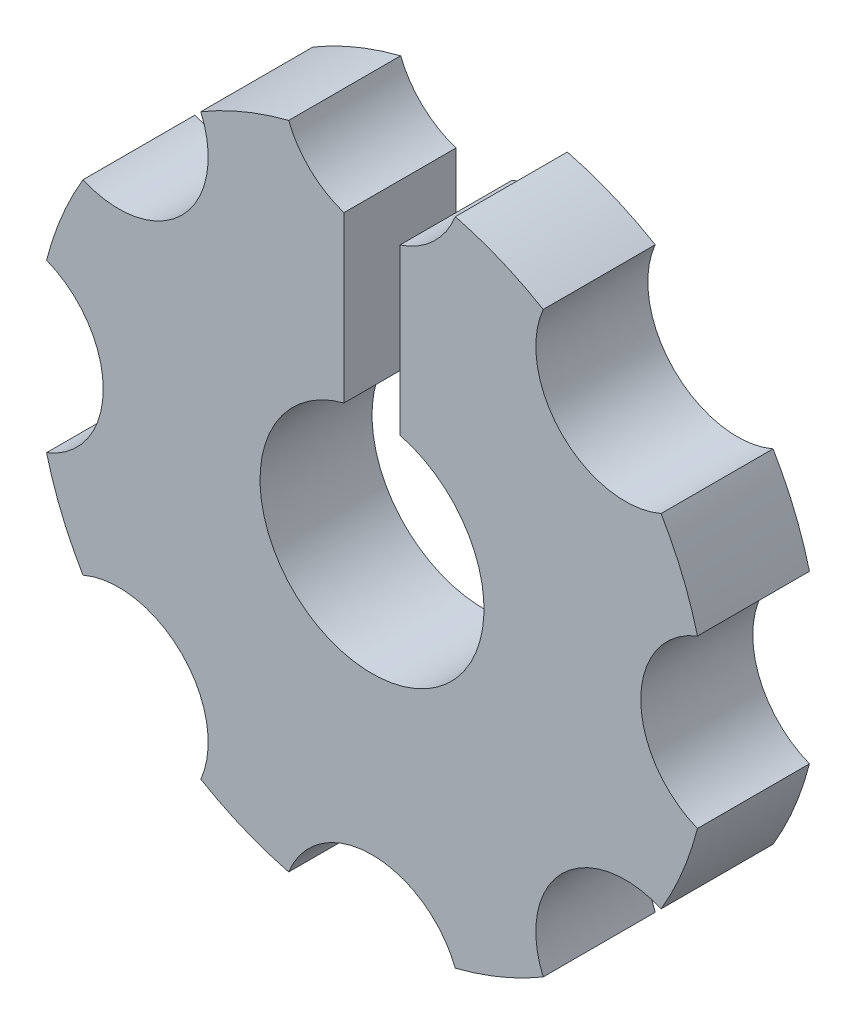
ISO-10303-21;
HEADER;
FILE_DESCRIPTION(('STEP AP214'),'2;1');
FILE_NAME('part.step','',(''),(''),'','','');
FILE_SCHEMA(('AUTOMOTIVE_DESIGN { 1 0 10303 214 1 1 1 1 }'));
ENDSEC;
DATA;
#1=APPLICATION_CONTEXT('core data for automotive mechanical design processes');
#2=APPLICATION_PROTOCOL_DEFINITION('international standard','automotive_design',2000,#1);
#3=PRODUCT_CONTEXT('',#1,'mechanical');
#4=PRODUCT('Part','Part','',(#3));
#5=PRODUCT_RELATED_PRODUCT_CATEGORY('part','',(#4));
#6=PRODUCT_DEFINITION_FORMATION('','',#4);
#7=PRODUCT_DEFINITION_CONTEXT('part definition',#1,'design');
#8=PRODUCT_DEFINITION('design','',#6,#7);
#9=PRODUCT_DEFINITION_SHAPE('','',#8);
#10=(LENGTH_UNIT() NAMED_UNIT(*) SI_UNIT(.MILLI.,.METRE.));
#11=(NAMED_UNIT(*) PLANE_ANGLE_UNIT() SI_UNIT($,.RADIAN.));
#12=(NAMED_UNIT(*) SI_UNIT($,.STERADIAN.) SOLID_ANGLE_UNIT());
#13=UNCERTAINTY_MEASURE_WITH_UNIT(LENGTH_MEASURE(1.E-05),#10,'distance_accuracy_value','');
#14=(GEOMETRIC_REPRESENTATION_CONTEXT(3) GLOBAL_UNCERTAINTY_ASSIGNED_CONTEXT((#13)) GLOBAL_UNIT_ASSIGNED_CONTEXT((#10,
#11,#12)) REPRESENTATION_CONTEXT('',''));
#15=CARTESIAN_POINT('',(0.,0.,0.));
#16=DIRECTION('',(0.,0.,1.));
#17=DIRECTION('',(1.,0.,0.));
#18=AXIS2_PLACEMENT_3D('',#15,#16,#17);
#19=CARTESIAN_POINT('',(0.,0.,3.175));
#20=DIRECTION('',(0.,0.,1.));
#21=DIRECTION('',(1.,0.,0.));
#22=AXIS2_PLACEMENT_3D('',#19,#20,#21);
#23=PLANE('',#22);
#24=CARTESIAN_POINT('',(0.,10.16,3.175));
#25=DIRECTION('',(0.,0.,1.));
#26=DIRECTION('',(1.,0.,0.));
#27=AXIS2_PLACEMENT_3D('',#24,#25,#26);
#28=CIRCLE('',#27,2.54);
#29=CARTESIAN_POINT('',(0.79375,7.74720889062065,3.175));
#30=VERTEX_POINT('',#29);
#31=CARTESIAN_POINT('',(2.36257324105224,9.22734374999999,3.175));
#32=VERTEX_POINT('',#31);
#33=EDGE_CURVE('E191',#30,#32,#28,.T.);
#34=ORIENTED_EDGE('',*,*,#33,.F.);
#35=DIRECTION('',(0.,-1.,0.));
#36=VECTOR('',#35,1.);
#37=CARTESIAN_POINT('',(0.79375,9.22734375000001,3.175));
#38=LINE('',#37,#36);
#39=CARTESIAN_POINT('',(0.79375,3.07418053105214,3.175));
#40=VERTEX_POINT('',#39);
#41=EDGE_CURVE('E53',#30,#40,#38,.T.);
#42=ORIENTED_EDGE('',*,*,#41,.T.);
#43=CARTESIAN_POINT('',(0.,0.,3.175));
#44=DIRECTION('',(0.,0.,1.));
#45=DIRECTION('',(1.,0.,0.));
#46=AXIS2_PLACEMENT_3D('',#43,#44,#45);
#47=CIRCLE('',#46,3.175);
#48=CARTESIAN_POINT('',(-0.79375,3.07418053105214,3.175));
#49=VERTEX_POINT('',#48);
#50=EDGE_CURVE('E189',#49,#40,#47,.T.);
#51=ORIENTED_EDGE('',*,*,#50,.F.);
#52=DIRECTION('',(0.,-1.,0.));
#53=VECTOR('',#52,1.);
#54=CARTESIAN_POINT('',(-0.79375,9.22734375000001,3.175));
#55=LINE('',#54,#53);
#56=CARTESIAN_POINT('',(-0.79375,7.74720889062067,3.175));
#57=VERTEX_POINT('',#56);
#58=EDGE_CURVE('E193',#57,#49,#55,.T.);
#59=ORIENTED_EDGE('',*,*,#58,.F.);
#60=CARTESIAN_POINT('',(-2.36257324105218,9.22734375000001,3.175));
#61=VERTEX_POINT('',#60);
#62=EDGE_CURVE('E246',#61,#57,#28,.T.);
#63=ORIENTED_EDGE('',*,*,#62,.F.);
#64=CARTESIAN_POINT('',(0.,0.,3.175));
#65=DIRECTION('',(0.,0.,1.));
#66=DIRECTION('',(1.,0.,0.));
#67=AXIS2_PLACEMENT_3D('',#64,#65,#66);
#68=CIRCLE('',#67,9.525);
#69=CARTESIAN_POINT('',(-4.8541257781664,8.19530889776221,3.175));
#70=VERTEX_POINT('',#69);
#71=EDGE_CURVE('E298',#61,#70,#68,.T.);
#72=ORIENTED_EDGE('',*,*,#71,.T.);
#73=CARTESIAN_POINT('',(-7.18420489685531,7.18420489685533,3.175));
#74=DIRECTION('',(0.,0.,1.));
#75=DIRECTION('',(1.,0.,0.));
#76=AXIS2_PLACEMENT_3D('',#73,#74,#75);
#77=CIRCLE('',#76,2.54);
#78=CARTESIAN_POINT('',(-8.1953088977622,4.85412577816642,3.175));
#79=VERTEX_POINT('',#78);
#80=EDGE_CURVE('E269',#79,#70,#77,.T.);
#81=ORIENTED_EDGE('',*,*,#80,.F.);
#82=CARTESIAN_POINT('',(-9.22734375,2.36257324105221,3.175));
#83=VERTEX_POINT('',#82);
#84=EDGE_CURVE('E217',#79,#83,#68,.T.);
#85=ORIENTED_EDGE('',*,*,#84,.T.);
#86=CARTESIAN_POINT('',(-10.16,0.,3.175));
#87=DIRECTION('',(0.,0.,1.));
#88=DIRECTION('',(1.,0.,0.));
#89=AXIS2_PLACEMENT_3D('',#86,#87,#88);
#90=CIRCLE('',#89,2.54);
#91=CARTESIAN_POINT('',(-9.22734375,-2.36257324105221,3.175));
#92=VERTEX_POINT('',#91);
#93=EDGE_CURVE('E209',#92,#83,#90,.T.);
#94=ORIENTED_EDGE('',*,*,#93,.F.);
#95=CARTESIAN_POINT('',(-8.19530889776226,-4.85412577816631,3.175));
#96=VERTEX_POINT('',#95);
#97=EDGE_CURVE('E212',#92,#96,#68,.T.);
#98=ORIENTED_EDGE('',*,*,#97,.T.);
#99=CARTESIAN_POINT('',(-7.18420489685541,-7.18420489685524,3.175));
#100=DIRECTION('',(0.,0.,1.));
#101=DIRECTION('',(1.,0.,0.));
#102=AXIS2_PLACEMENT_3D('',#99,#100,#101);
#103=CIRCLE('',#102,2.54);
#104=CARTESIAN_POINT('',(-4.85412577816651,-8.19530889776215,3.175));
#105=VERTEX_POINT('',#104);
#106=EDGE_CURVE('E182',#105,#96,#103,.T.);
#107=ORIENTED_EDGE('',*,*,#106,.F.);
#108=CARTESIAN_POINT('',(-2.36257324105231,-9.22734374999997,3.175));
#109=VERTEX_POINT('',#108);
#110=EDGE_CURVE('E216',#105,#109,#68,.T.);
#111=ORIENTED_EDGE('',*,*,#110,.T.);
#112=CARTESIAN_POINT('',(-1.06910833535982E-13,-10.16,3.175));
#113=DIRECTION('',(0.,0.,1.));
#114=DIRECTION('',(1.,0.,0.));
#115=AXIS2_PLACEMENT_3D('',#112,#113,#114);
#116=CIRCLE('',#115,2.54);
#117=CARTESIAN_POINT('',(2.36257324105211,-9.22734375000003,3.175));
#118=VERTEX_POINT('',#117);
#119=EDGE_CURVE('E344',#118,#109,#116,.T.);
#120=ORIENTED_EDGE('',*,*,#119,.F.);
#121=CARTESIAN_POINT('',(4.85412577816634,-8.19530889776225,3.175));
#122=VERTEX_POINT('',#121);
#123=EDGE_CURVE('E416',#118,#122,#68,.T.);
#124=ORIENTED_EDGE('',*,*,#123,.T.);
#125=CARTESIAN_POINT('',(7.18420489685526,-7.18420489685538,3.175));
#126=DIRECTION('',(0.,0.,1.));
#127=DIRECTION('',(1.,0.,0.));
#128=AXIS2_PLACEMENT_3D('',#125,#126,#127);
#129=CIRCLE('',#128,2.54);
#130=CARTESIAN_POINT('',(8.19530889776216,-4.85412577816648,3.175));
#131=VERTEX_POINT('',#130);
#132=EDGE_CURVE('E346',#131,#122,#129,.T.);
#133=ORIENTED_EDGE('',*,*,#132,.F.);
#134=CARTESIAN_POINT('',(9.22734374999999,-2.36257324105227,3.175));
#135=VERTEX_POINT('',#134);
#136=EDGE_CURVE('E412',#131,#135,#68,.T.);
#137=ORIENTED_EDGE('',*,*,#136,.T.);
#138=CARTESIAN_POINT('',(10.16,0.,3.175));
#139=DIRECTION('',(0.,0.,1.));
#140=DIRECTION('',(1.,0.,0.));
#141=AXIS2_PLACEMENT_3D('',#138,#139,#140);
#142=CIRCLE('',#141,2.54);
#143=CARTESIAN_POINT('',(9.22734375000002,2.36257324105215,3.175));
#144=VERTEX_POINT('',#143);
#145=EDGE_CURVE('E372',#144,#135,#142,.T.);
#146=ORIENTED_EDGE('',*,*,#145,.F.);
#147=CARTESIAN_POINT('',(8.19530889776223,4.85412577816637,3.175));
#148=VERTEX_POINT('',#147);
#149=EDGE_CURVE('E399',#144,#148,#68,.T.);
#150=ORIENTED_EDGE('',*,*,#149,.T.);
#151=CARTESIAN_POINT('',(7.18420489685536,7.18420489685528,3.175));
#152=DIRECTION('',(0.,0.,1.));
#153=DIRECTION('',(1.,0.,0.));
#154=AXIS2_PLACEMENT_3D('',#151,#152,#153);
#155=CIRCLE('',#154,2.54);
#156=CARTESIAN_POINT('',(4.85412577816645,8.19530889776218,3.175));
#157=VERTEX_POINT('',#156);
#158=EDGE_CURVE('E386',#157,#148,#155,.T.);
#159=ORIENTED_EDGE('',*,*,#158,.F.);
#160=EDGE_CURVE('E408',#157,#32,#68,.T.);
#161=ORIENTED_EDGE('',*,*,#160,.T.);
#162=EDGE_LOOP('',(#34,#42,#51,#59,#63,#72,#81,#85,#94,#98,#107,#111,#120,#124,#133,#137,#146,
#150,#159,#161));
#163=FACE_BOUND('',#162,.T.);
#164=ADVANCED_FACE('F38',(#163),#23,.T.);
#165=CARTESIAN_POINT('',(0.,0.,0.));
#166=DIRECTION('',(0.,0.,1.));
#167=DIRECTION('',(1.,0.,0.));
#168=AXIS2_PLACEMENT_3D('',#165,#166,#167);
#169=PLANE('',#168);
#170=DIRECTION('',(0.,-1.,0.));
#171=VECTOR('',#170,1.);
#172=CARTESIAN_POINT('',(0.79375,9.22734375000001,0.));
#173=LINE('',#172,#171);
#174=CARTESIAN_POINT('',(0.79375,7.74720889062065,0.));
#175=VERTEX_POINT('',#174);
#176=CARTESIAN_POINT('',(0.79375,3.07418053105214,0.));
#177=VERTEX_POINT('',#176);
#178=EDGE_CURVE('E176',#175,#177,#173,.T.);
#179=ORIENTED_EDGE('',*,*,#178,.F.);
#180=CARTESIAN_POINT('',(0.,10.16,0.));
#181=DIRECTION('',(0.,0.,1.));
#182=DIRECTION('',(1.,0.,0.));
#183=AXIS2_PLACEMENT_3D('',#180,#181,#182);
#184=CIRCLE('',#183,2.54);
#185=CARTESIAN_POINT('',(2.36257324105224,9.22734374999999,0.));
#186=VERTEX_POINT('',#185);
#187=EDGE_CURVE('E254',#175,#186,#184,.T.);
#188=ORIENTED_EDGE('',*,*,#187,.T.);
#189=CARTESIAN_POINT('',(0.,0.,0.));
#190=DIRECTION('',(0.,0.,1.));
#191=DIRECTION('',(1.,0.,0.));
#192=AXIS2_PLACEMENT_3D('',#189,#190,#191);
#193=CIRCLE('',#192,9.525);
#194=CARTESIAN_POINT('',(4.85412577816645,8.19530889776218,0.));
#195=VERTEX_POINT('',#194);
#196=EDGE_CURVE('E300',#195,#186,#193,.T.);
#197=ORIENTED_EDGE('',*,*,#196,.F.);
#198=CARTESIAN_POINT('',(7.18420489685536,7.18420489685528,0.));
#199=DIRECTION('',(0.,0.,1.));
#200=DIRECTION('',(1.,0.,0.));
#201=AXIS2_PLACEMENT_3D('',#198,#199,#200);
#202=CIRCLE('',#201,2.54);
#203=CARTESIAN_POINT('',(8.19530889776223,4.85412577816637,0.));
#204=VERTEX_POINT('',#203);
#205=EDGE_CURVE('E387',#195,#204,#202,.T.);
#206=ORIENTED_EDGE('',*,*,#205,.T.);
#207=CARTESIAN_POINT('',(9.22734375000002,2.36257324105215,0.));
#208=VERTEX_POINT('',#207);
#209=EDGE_CURVE('E303',#208,#204,#193,.T.);
#210=ORIENTED_EDGE('',*,*,#209,.F.);
#211=CARTESIAN_POINT('',(10.16,0.,0.));
#212=DIRECTION('',(0.,0.,1.));
#213=DIRECTION('',(1.,0.,0.));
#214=AXIS2_PLACEMENT_3D('',#211,#212,#213);
#215=CIRCLE('',#214,2.54);
#216=CARTESIAN_POINT('',(9.22734374999999,-2.36257324105227,0.));
#217=VERTEX_POINT('',#216);
#218=EDGE_CURVE('E373',#208,#217,#215,.T.);
#219=ORIENTED_EDGE('',*,*,#218,.T.);
#220=CARTESIAN_POINT('',(8.19530889776216,-4.85412577816648,0.));
#221=VERTEX_POINT('',#220);
#222=EDGE_CURVE('E309',#221,#217,#193,.T.);
#223=ORIENTED_EDGE('',*,*,#222,.F.);
#224=CARTESIAN_POINT('',(7.18420489685526,-7.18420489685538,0.));
#225=DIRECTION('',(0.,0.,1.));
#226=DIRECTION('',(1.,0.,0.));
#227=AXIS2_PLACEMENT_3D('',#224,#225,#226);
#228=CIRCLE('',#227,2.54);
#229=CARTESIAN_POINT('',(4.85412577816634,-8.19530889776225,0.));
#230=VERTEX_POINT('',#229);
#231=EDGE_CURVE('E360',#221,#230,#228,.T.);
#232=ORIENTED_EDGE('',*,*,#231,.T.);
#233=CARTESIAN_POINT('',(2.36257324105211,-9.22734375000003,0.));
#234=VERTEX_POINT('',#233);
#235=EDGE_CURVE('E316',#234,#230,#193,.T.);
#236=ORIENTED_EDGE('',*,*,#235,.F.);
#237=CARTESIAN_POINT('',(-1.06910833535982E-13,-10.16,0.));
#238=DIRECTION('',(0.,0.,1.));
#239=DIRECTION('',(1.,0.,0.));
#240=AXIS2_PLACEMENT_3D('',#237,#238,#239);
#241=CIRCLE('',#240,2.54);
#242=CARTESIAN_POINT('',(-2.36257324105231,-9.22734374999997,0.));
#243=VERTEX_POINT('',#242);
#244=EDGE_CURVE('E342',#234,#243,#241,.T.);
#245=ORIENTED_EDGE('',*,*,#244,.T.);
#246=CARTESIAN_POINT('',(-4.85412577816651,-8.19530889776215,0.));
#247=VERTEX_POINT('',#246);
#248=EDGE_CURVE('E221',#247,#243,#193,.T.);
#249=ORIENTED_EDGE('',*,*,#248,.F.);
#250=CARTESIAN_POINT('',(-7.18420489685541,-7.18420489685524,0.));
#251=DIRECTION('',(0.,0.,1.));
#252=DIRECTION('',(1.,0.,0.));
#253=AXIS2_PLACEMENT_3D('',#250,#251,#252);
#254=CIRCLE('',#253,2.54);
#255=CARTESIAN_POINT('',(-8.19530889776226,-4.85412577816631,0.));
#256=VERTEX_POINT('',#255);
#257=EDGE_CURVE('E237',#247,#256,#254,.T.);
#258=ORIENTED_EDGE('',*,*,#257,.T.);
#259=CARTESIAN_POINT('',(-9.22734375,-2.36257324105221,0.));
#260=VERTEX_POINT('',#259);
#261=EDGE_CURVE('E205',#260,#256,#193,.T.);
#262=ORIENTED_EDGE('',*,*,#261,.F.);
#263=CARTESIAN_POINT('',(-10.16,0.,0.));
#264=DIRECTION('',(0.,0.,1.));
#265=DIRECTION('',(1.,0.,0.));
#266=AXIS2_PLACEMENT_3D('',#263,#264,#265);
#267=CIRCLE('',#266,2.54);
#268=CARTESIAN_POINT('',(-9.22734375,2.36257324105221,0.));
#269=VERTEX_POINT('',#268);
#270=EDGE_CURVE('E206',#260,#269,#267,.T.);
#271=ORIENTED_EDGE('',*,*,#270,.T.);
#272=CARTESIAN_POINT('',(-8.1953088977622,4.85412577816642,0.));
#273=VERTEX_POINT('',#272);
#274=EDGE_CURVE('E198',#273,#269,#193,.T.);
#275=ORIENTED_EDGE('',*,*,#274,.F.);
#276=CARTESIAN_POINT('',(-7.18420489685531,7.18420489685533,0.));
#277=DIRECTION('',(0.,0.,1.));
#278=DIRECTION('',(1.,0.,0.));
#279=AXIS2_PLACEMENT_3D('',#276,#277,#278);
#280=CIRCLE('',#279,2.54);
#281=CARTESIAN_POINT('',(-4.8541257781664,8.19530889776221,0.));
#282=VERTEX_POINT('',#281);
#283=EDGE_CURVE('E270',#273,#282,#280,.T.);
#284=ORIENTED_EDGE('',*,*,#283,.T.);
#285=CARTESIAN_POINT('',(-2.36257324105218,9.22734375000001,0.));
#286=VERTEX_POINT('',#285);
#287=EDGE_CURVE('E203',#286,#282,#193,.T.);
#288=ORIENTED_EDGE('',*,*,#287,.F.);
#289=CARTESIAN_POINT('',(-0.79375,7.74720889062067,0.));
#290=VERTEX_POINT('',#289);
#291=EDGE_CURVE('E258',#286,#290,#184,.T.);
#292=ORIENTED_EDGE('',*,*,#291,.T.);
#293=DIRECTION('',(0.,-1.,0.));
#294=VECTOR('',#293,1.);
#295=CARTESIAN_POINT('',(-0.79375,9.22734375000001,0.));
#296=LINE('',#295,#294);
#297=CARTESIAN_POINT('',(-0.79375,3.07418053105214,0.));
#298=VERTEX_POINT('',#297);
#299=EDGE_CURVE('E61',#290,#298,#296,.T.);
#300=ORIENTED_EDGE('',*,*,#299,.T.);
#301=CARTESIAN_POINT('',(0.,0.,0.));
#302=DIRECTION('',(0.,0.,1.));
#303=DIRECTION('',(1.,0.,0.));
#304=AXIS2_PLACEMENT_3D('',#301,#302,#303);
#305=CIRCLE('',#304,3.175);
#306=EDGE_CURVE('E199',#298,#177,#305,.T.);
#307=ORIENTED_EDGE('',*,*,#306,.T.);
#308=EDGE_LOOP('',(#179,#188,#197,#206,#210,#219,#223,#232,#236,#245,#249,#258,#262,#271,#275,
#284,#288,#292,#300,#307));
#309=FACE_BOUND('',#308,.T.);
#310=ADVANCED_FACE('F290',(#309),#169,.F.);
#311=CARTESIAN_POINT('',(0.,0.,3.175));
#312=DIRECTION('',(0.,0.,-1.));
#313=DIRECTION('',(-1.,0.,0.));
#314=AXIS2_PLACEMENT_3D('',#311,#312,#313);
#315=CYLINDRICAL_SURFACE('',#314,3.175);
#316=ORIENTED_EDGE('',*,*,#50,.T.);
#317=DIRECTION('',(0.,0.,-1.));
#318=VECTOR('',#317,1.);
#319=CARTESIAN_POINT('',(0.79375,3.07418053105214,3.175));
#320=LINE('',#319,#318);
#321=EDGE_CURVE('E173',#40,#177,#320,.T.);
#322=ORIENTED_EDGE('',*,*,#321,.T.);
#323=ORIENTED_EDGE('',*,*,#306,.F.);
#324=DIRECTION('',(0.,0.,-1.));
#325=VECTOR('',#324,1.);
#326=CARTESIAN_POINT('',(-0.79375,3.07418053105214,3.175));
#327=LINE('',#326,#325);
#328=EDGE_CURVE('E183',#298,#49,#327,.F.);
#329=ORIENTED_EDGE('',*,*,#328,.T.);
#330=EDGE_LOOP('',(#316,#322,#323,#329));
#331=FACE_BOUND('',#330,.T.);
#332=ADVANCED_FACE('F196',(#331),#315,.F.);
#333=CARTESIAN_POINT('',(0.,10.16,0.));
#334=DIRECTION('',(0.,0.,1.));
#335=DIRECTION('',(1.,0.,0.));
#336=AXIS2_PLACEMENT_3D('',#333,#334,#335);
#337=CYLINDRICAL_SURFACE('',#336,2.54);
#338=DIRECTION('',(0.,0.,1.));
#339=VECTOR('',#338,1.);
#340=CARTESIAN_POINT('',(0.79375,7.74720889062065,0.));
#341=LINE('',#340,#339);
#342=EDGE_CURVE('E11',#30,#175,#341,.F.);
#343=ORIENTED_EDGE('',*,*,#342,.F.);
#344=ORIENTED_EDGE('',*,*,#33,.T.);
#345=DIRECTION('',(0.,0.,1.));
#346=VECTOR('',#345,1.);
#347=CARTESIAN_POINT('',(2.36257324105224,9.22734374999999,1.5875));
#348=LINE('',#347,#346);
#349=EDGE_CURVE('E265',#186,#32,#348,.T.);
#350=ORIENTED_EDGE('',*,*,#349,.F.);
#351=ORIENTED_EDGE('',*,*,#187,.F.);
#352=EDGE_LOOP('',(#343,#344,#350,#351));
#353=FACE_BOUND('',#352,.T.);
#354=ADVANCED_FACE('F405',(#353),#337,.F.);
#355=DIRECTION('',(0.,0.,1.));
#356=VECTOR('',#355,1.);
#357=CARTESIAN_POINT('',(-0.79375,7.74720889062067,0.));
#358=LINE('',#357,#356);
#359=EDGE_CURVE('E47',#290,#57,#358,.T.);
#360=ORIENTED_EDGE('',*,*,#359,.F.);
#361=ORIENTED_EDGE('',*,*,#291,.F.);
#362=DIRECTION('',(0.,0.,1.));
#363=VECTOR('',#362,1.);
#364=CARTESIAN_POINT('',(-2.36257324105218,9.22734375000001,1.5875));
#365=LINE('',#364,#363);
#366=EDGE_CURVE('E252',#61,#286,#365,.F.);
#367=ORIENTED_EDGE('',*,*,#366,.F.);
#368=ORIENTED_EDGE('',*,*,#62,.T.);
#369=EDGE_LOOP('',(#360,#361,#367,#368));
#370=FACE_BOUND('',#369,.T.);
#371=ADVANCED_FACE('F250',(#370),#337,.F.);
#372=CARTESIAN_POINT('',(0.,0.,3.175));
#373=DIRECTION('',(0.,0.,-1.));
#374=DIRECTION('',(-1.,0.,0.));
#375=AXIS2_PLACEMENT_3D('',#372,#373,#374);
#376=CYLINDRICAL_SURFACE('',#375,9.525);
#377=ORIENTED_EDGE('',*,*,#261,.T.);
#378=DIRECTION('',(0.,0.,1.));
#379=VECTOR('',#378,1.);
#380=CARTESIAN_POINT('',(-8.19530889776226,-4.85412577816631,1.5875));
#381=LINE('',#380,#379);
#382=EDGE_CURVE('E355',#256,#96,#381,.T.);
#383=ORIENTED_EDGE('',*,*,#382,.T.);
#384=ORIENTED_EDGE('',*,*,#97,.F.);
#385=DIRECTION('',(0.,0.,1.));
#386=VECTOR('',#385,1.);
#387=CARTESIAN_POINT('',(-9.22734375,-2.36257324105221,1.5875));
#388=LINE('',#387,#386);
#389=EDGE_CURVE('E215',#92,#260,#388,.F.);
#390=ORIENTED_EDGE('',*,*,#389,.T.);
#391=EDGE_LOOP('',(#377,#383,#384,#390));
#392=FACE_BOUND('',#391,.T.);
#393=ADVANCED_FACE('F437',(#392),#376,.T.);
#394=ORIENTED_EDGE('',*,*,#110,.F.);
#395=DIRECTION('',(0.,0.,1.));
#396=VECTOR('',#395,1.);
#397=CARTESIAN_POINT('',(-4.85412577816651,-8.19530889776215,1.5875));
#398=LINE('',#397,#396);
#399=EDGE_CURVE('E337',#105,#247,#398,.F.);
#400=ORIENTED_EDGE('',*,*,#399,.T.);
#401=ORIENTED_EDGE('',*,*,#248,.T.);
#402=DIRECTION('',(0.,0.,1.));
#403=VECTOR('',#402,1.);
#404=CARTESIAN_POINT('',(-2.36257324105231,-9.22734374999997,1.5875));
#405=LINE('',#404,#403);
#406=EDGE_CURVE('E336',#243,#109,#405,.T.);
#407=ORIENTED_EDGE('',*,*,#406,.T.);
#408=EDGE_LOOP('',(#394,#400,#401,#407));
#409=FACE_BOUND('',#408,.T.);
#410=ADVANCED_FACE('F335',(#409),#376,.T.);
#411=ORIENTED_EDGE('',*,*,#123,.F.);
#412=DIRECTION('',(0.,0.,1.));
#413=VECTOR('',#412,1.);
#414=CARTESIAN_POINT('',(2.36257324105211,-9.22734375000003,1.5875));
#415=LINE('',#414,#413);
#416=EDGE_CURVE('E347',#118,#234,#415,.F.);
#417=ORIENTED_EDGE('',*,*,#416,.T.);
#418=ORIENTED_EDGE('',*,*,#235,.T.);
#419=DIRECTION('',(0.,0.,1.));
#420=VECTOR('',#419,1.);
#421=CARTESIAN_POINT('',(4.85412577816634,-8.19530889776225,1.5875));
#422=LINE('',#421,#420);
#423=EDGE_CURVE('E369',#230,#122,#422,.T.);
#424=ORIENTED_EDGE('',*,*,#423,.T.);
#425=EDGE_LOOP('',(#411,#417,#418,#424));
#426=FACE_BOUND('',#425,.T.);
#427=ADVANCED_FACE('F475',(#426),#376,.T.);
#428=ORIENTED_EDGE('',*,*,#136,.F.);
#429=DIRECTION('',(0.,0.,1.));
#430=VECTOR('',#429,1.);
#431=CARTESIAN_POINT('',(8.19530889776216,-4.85412577816648,1.5875));
#432=LINE('',#431,#430);
#433=EDGE_CURVE('E363',#131,#221,#432,.F.);
#434=ORIENTED_EDGE('',*,*,#433,.T.);
#435=ORIENTED_EDGE('',*,*,#222,.T.);
#436=DIRECTION('',(0.,0.,1.));
#437=VECTOR('',#436,1.);
#438=CARTESIAN_POINT('',(9.22734374999999,-2.36257324105227,1.5875));
#439=LINE('',#438,#437);
#440=EDGE_CURVE('E383',#217,#135,#439,.T.);
#441=ORIENTED_EDGE('',*,*,#440,.T.);
#442=EDGE_LOOP('',(#428,#434,#435,#441));
#443=FACE_BOUND('',#442,.T.);
#444=ADVANCED_FACE('F473',(#443),#376,.T.);
#445=ORIENTED_EDGE('',*,*,#149,.F.);
#446=DIRECTION('',(0.,0.,1.));
#447=VECTOR('',#446,1.);
#448=CARTESIAN_POINT('',(9.22734375000002,2.36257324105215,1.5875));
#449=LINE('',#448,#447);
#450=EDGE_CURVE('E377',#144,#208,#449,.F.);
#451=ORIENTED_EDGE('',*,*,#450,.T.);
#452=ORIENTED_EDGE('',*,*,#209,.T.);
#453=DIRECTION('',(0.,0.,1.));
#454=VECTOR('',#453,1.);
#455=CARTESIAN_POINT('',(8.19530889776223,4.85412577816637,1.5875));
#456=LINE('',#455,#454);
#457=EDGE_CURVE('E260',#204,#148,#456,.T.);
#458=ORIENTED_EDGE('',*,*,#457,.T.);
#459=EDGE_LOOP('',(#445,#451,#452,#458));
#460=FACE_BOUND('',#459,.T.);
#461=ADVANCED_FACE('F398',(#460),#376,.T.);
#462=ORIENTED_EDGE('',*,*,#160,.F.);
#463=DIRECTION('',(0.,0.,1.));
#464=VECTOR('',#463,1.);
#465=CARTESIAN_POINT('',(4.85412577816645,8.19530889776218,1.5875));
#466=LINE('',#465,#464);
#467=EDGE_CURVE('E391',#157,#195,#466,.F.);
#468=ORIENTED_EDGE('',*,*,#467,.T.);
#469=ORIENTED_EDGE('',*,*,#196,.T.);
#470=ORIENTED_EDGE('',*,*,#349,.T.);
#471=EDGE_LOOP('',(#462,#468,#469,#470));
#472=FACE_BOUND('',#471,.T.);
#473=ADVANCED_FACE('F407',(#472),#376,.T.);
#474=ORIENTED_EDGE('',*,*,#71,.F.);
#475=ORIENTED_EDGE('',*,*,#366,.T.);
#476=ORIENTED_EDGE('',*,*,#287,.T.);
#477=DIRECTION('',(0.,0.,1.));
#478=VECTOR('',#477,1.);
#479=CARTESIAN_POINT('',(-4.8541257781664,8.19530889776221,1.5875));
#480=LINE('',#479,#478);
#481=EDGE_CURVE('E233',#282,#70,#480,.T.);
#482=ORIENTED_EDGE('',*,*,#481,.T.);
#483=EDGE_LOOP('',(#474,#475,#476,#482));
#484=FACE_BOUND('',#483,.T.);
#485=ADVANCED_FACE('F297',(#484),#376,.T.);
#486=ORIENTED_EDGE('',*,*,#84,.F.);
#487=DIRECTION('',(0.,0.,1.));
#488=VECTOR('',#487,1.);
#489=CARTESIAN_POINT('',(-8.1953088977622,4.85412577816642,1.5875));
#490=LINE('',#489,#488);
#491=EDGE_CURVE('E229',#79,#273,#490,.F.);
#492=ORIENTED_EDGE('',*,*,#491,.T.);
#493=ORIENTED_EDGE('',*,*,#274,.T.);
#494=DIRECTION('',(0.,0.,1.));
#495=VECTOR('',#494,1.);
#496=CARTESIAN_POINT('',(-9.22734375,2.36257324105221,1.5875));
#497=LINE('',#496,#495);
#498=EDGE_CURVE('E225',#269,#83,#497,.T.);
#499=ORIENTED_EDGE('',*,*,#498,.T.);
#500=EDGE_LOOP('',(#486,#492,#493,#499));
#501=FACE_BOUND('',#500,.T.);
#502=ADVANCED_FACE('F40',(#501),#376,.T.);
#503=CARTESIAN_POINT('',(-10.16,0.,0.));
#504=DIRECTION('',(0.,0.,1.));
#505=DIRECTION('',(1.,0.,0.));
#506=AXIS2_PLACEMENT_3D('',#503,#504,#505);
#507=CYLINDRICAL_SURFACE('',#506,2.54);
#508=ORIENTED_EDGE('',*,*,#270,.F.);
#509=ORIENTED_EDGE('',*,*,#389,.F.);
#510=ORIENTED_EDGE('',*,*,#93,.T.);
#511=ORIENTED_EDGE('',*,*,#498,.F.);
#512=EDGE_LOOP('',(#508,#509,#510,#511));
#513=FACE_BOUND('',#512,.T.);
#514=ADVANCED_FACE('F286',(#513),#507,.F.);
#515=CARTESIAN_POINT('',(-7.18420489685531,7.18420489685533,0.));
#516=DIRECTION('',(0.,0.,1.));
#517=DIRECTION('',(1.,0.,0.));
#518=AXIS2_PLACEMENT_3D('',#515,#516,#517);
#519=CYLINDRICAL_SURFACE('',#518,2.54);
#520=ORIENTED_EDGE('',*,*,#283,.F.);
#521=ORIENTED_EDGE('',*,*,#491,.F.);
#522=ORIENTED_EDGE('',*,*,#80,.T.);
#523=ORIENTED_EDGE('',*,*,#481,.F.);
#524=EDGE_LOOP('',(#520,#521,#522,#523));
#525=FACE_BOUND('',#524,.T.);
#526=ADVANCED_FACE('F294',(#525),#519,.F.);
#527=CARTESIAN_POINT('',(7.18420489685536,7.18420489685528,0.));
#528=DIRECTION('',(0.,0.,1.));
#529=DIRECTION('',(1.,0.,0.));
#530=AXIS2_PLACEMENT_3D('',#527,#528,#529);
#531=CYLINDRICAL_SURFACE('',#530,2.54);
#532=ORIENTED_EDGE('',*,*,#205,.F.);
#533=ORIENTED_EDGE('',*,*,#467,.F.);
#534=ORIENTED_EDGE('',*,*,#158,.T.);
#535=ORIENTED_EDGE('',*,*,#457,.F.);
#536=EDGE_LOOP('',(#532,#533,#534,#535));
#537=FACE_BOUND('',#536,.T.);
#538=ADVANCED_FACE('F401',(#537),#531,.F.);
#539=CARTESIAN_POINT('',(10.16,0.,0.));
#540=DIRECTION('',(0.,0.,1.));
#541=DIRECTION('',(1.,0.,0.));
#542=AXIS2_PLACEMENT_3D('',#539,#540,#541);
#543=CYLINDRICAL_SURFACE('',#542,2.54);
#544=ORIENTED_EDGE('',*,*,#218,.F.);
#545=ORIENTED_EDGE('',*,*,#450,.F.);
#546=ORIENTED_EDGE('',*,*,#145,.T.);
#547=ORIENTED_EDGE('',*,*,#440,.F.);
#548=EDGE_LOOP('',(#544,#545,#546,#547));
#549=FACE_BOUND('',#548,.T.);
#550=ADVANCED_FACE('F465',(#549),#543,.F.);
#551=CARTESIAN_POINT('',(7.18420489685526,-7.18420489685538,0.));
#552=DIRECTION('',(0.,0.,1.));
#553=DIRECTION('',(1.,0.,0.));
#554=AXIS2_PLACEMENT_3D('',#551,#552,#553);
#555=CYLINDRICAL_SURFACE('',#554,2.54);
#556=ORIENTED_EDGE('',*,*,#231,.F.);
#557=ORIENTED_EDGE('',*,*,#433,.F.);
#558=ORIENTED_EDGE('',*,*,#132,.T.);
#559=ORIENTED_EDGE('',*,*,#423,.F.);
#560=EDGE_LOOP('',(#556,#557,#558,#559));
#561=FACE_BOUND('',#560,.T.);
#562=ADVANCED_FACE('F446',(#561),#555,.F.);
#563=CARTESIAN_POINT('',(-1.06910833535982E-13,-10.16,0.));
#564=DIRECTION('',(0.,0.,1.));
#565=DIRECTION('',(1.,0.,0.));
#566=AXIS2_PLACEMENT_3D('',#563,#564,#565);
#567=CYLINDRICAL_SURFACE('',#566,2.54);
#568=ORIENTED_EDGE('',*,*,#244,.F.);
#569=ORIENTED_EDGE('',*,*,#416,.F.);
#570=ORIENTED_EDGE('',*,*,#119,.T.);
#571=ORIENTED_EDGE('',*,*,#406,.F.);
#572=EDGE_LOOP('',(#568,#569,#570,#571));
#573=FACE_BOUND('',#572,.T.);
#574=ADVANCED_FACE('F341',(#573),#567,.F.);
#575=CARTESIAN_POINT('',(-7.18420489685541,-7.18420489685524,0.));
#576=DIRECTION('',(0.,0.,1.));
#577=DIRECTION('',(1.,0.,0.));
#578=AXIS2_PLACEMENT_3D('',#575,#576,#577);
#579=CYLINDRICAL_SURFACE('',#578,2.54);
#580=ORIENTED_EDGE('',*,*,#257,.F.);
#581=ORIENTED_EDGE('',*,*,#399,.F.);
#582=ORIENTED_EDGE('',*,*,#106,.T.);
#583=ORIENTED_EDGE('',*,*,#382,.F.);
#584=EDGE_LOOP('',(#580,#581,#582,#583));
#585=FACE_BOUND('',#584,.T.);
#586=ADVANCED_FACE('F438',(#585),#579,.F.);
#587=CARTESIAN_POINT('',(-0.79375,9.22734375000001,0.));
#588=DIRECTION('',(1.,0.,0.));
#589=DIRECTION('',(0.,0.,-1.));
#590=AXIS2_PLACEMENT_3D('',#587,#588,#589);
#591=PLANE('',#590);
#592=ORIENTED_EDGE('',*,*,#299,.F.);
#593=ORIENTED_EDGE('',*,*,#359,.T.);
#594=ORIENTED_EDGE('',*,*,#58,.T.);
#595=ORIENTED_EDGE('',*,*,#328,.F.);
#596=EDGE_LOOP('',(#592,#593,#594,#595));
#597=FACE_BOUND('',#596,.T.);
#598=ADVANCED_FACE('F241',(#597),#591,.T.);
#599=CARTESIAN_POINT('',(0.79375,9.22734375000001,0.));
#600=DIRECTION('',(-1.,0.,0.));
#601=DIRECTION('',(0.,0.,1.));
#602=AXIS2_PLACEMENT_3D('',#599,#600,#601);
#603=PLANE('',#602);
#604=ORIENTED_EDGE('',*,*,#41,.F.);
#605=ORIENTED_EDGE('',*,*,#342,.T.);
#606=ORIENTED_EDGE('',*,*,#178,.T.);
#607=ORIENTED_EDGE('',*,*,#321,.F.);
#608=EDGE_LOOP('',(#604,#605,#606,#607));
#609=FACE_BOUND('',#608,.T.);
#610=ADVANCED_FACE('F174',(#609),#603,.T.);
#611=CLOSED_SHELL('',(#164,#310,#332,#354,#371,#393,#410,#427,#444,#461,#473,#485,#502,#514,
#526,#538,#550,#562,#574,#586,#598,#610));
#612=MANIFOLD_SOLID_BREP('B2',#611);
#613=ADVANCED_BREP_SHAPE_REPRESENTATION('',(#18,#612),#14);
#614=SHAPE_DEFINITION_REPRESENTATION(#9,#613);
ENDSEC;
END-ISO-10303-21;
